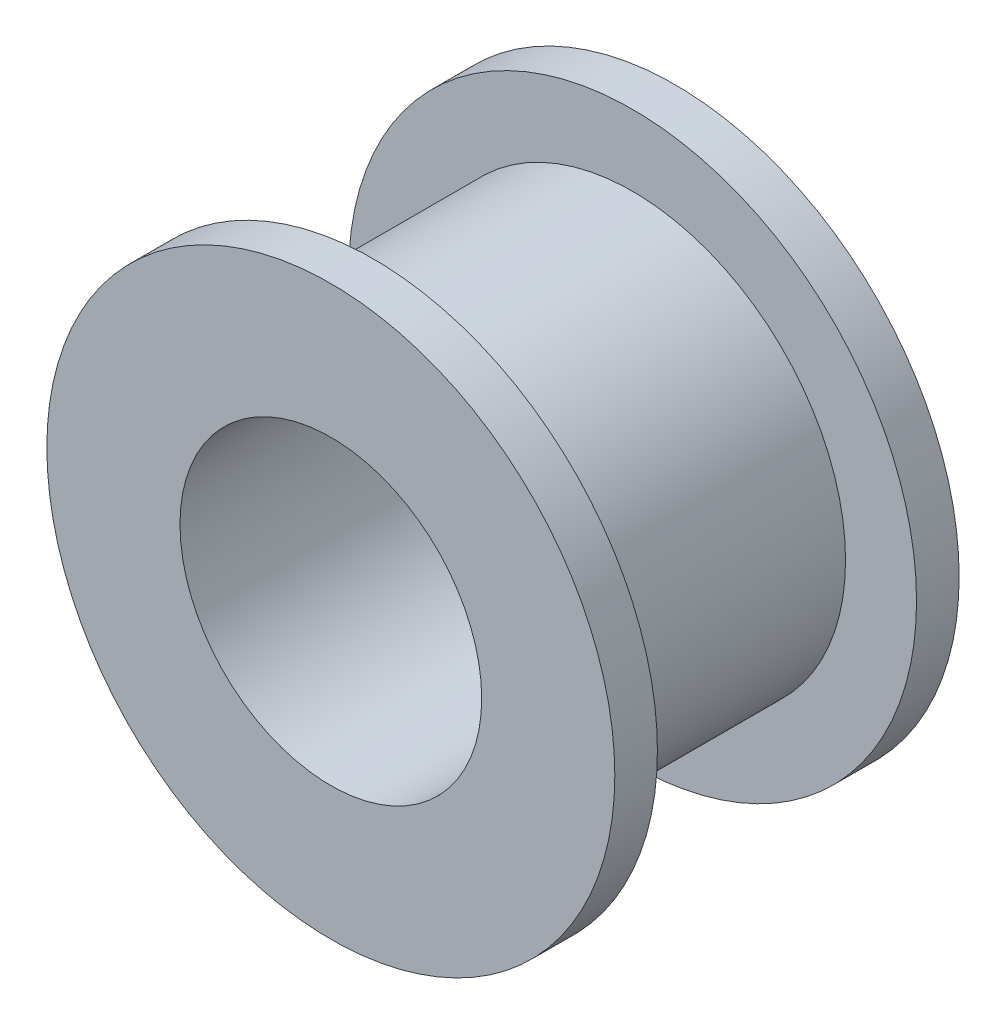
ISO-10303-21;
HEADER;
FILE_DESCRIPTION(('STEP AP214'),'2;1');
FILE_NAME('part.step','',(''),(''),'','','');
FILE_SCHEMA(('AUTOMOTIVE_DESIGN { 1 0 10303 214 1 1 1 1 }'));
ENDSEC;
DATA;
#1=APPLICATION_CONTEXT('core data for automotive mechanical design processes');
#2=APPLICATION_PROTOCOL_DEFINITION('international standard','automotive_design',2000,#1);
#3=PRODUCT_CONTEXT('',#1,'mechanical');
#4=PRODUCT('Part','Part','',(#3));
#5=PRODUCT_RELATED_PRODUCT_CATEGORY('part','',(#4));
#6=PRODUCT_DEFINITION_FORMATION('','',#4);
#7=PRODUCT_DEFINITION_CONTEXT('part definition',#1,'design');
#8=PRODUCT_DEFINITION('design','',#6,#7);
#9=PRODUCT_DEFINITION_SHAPE('','',#8);
#10=(LENGTH_UNIT() NAMED_UNIT(*) SI_UNIT(.MILLI.,.METRE.));
#11=(NAMED_UNIT(*) PLANE_ANGLE_UNIT() SI_UNIT($,.RADIAN.));
#12=(NAMED_UNIT(*) SI_UNIT($,.STERADIAN.) SOLID_ANGLE_UNIT());
#13=UNCERTAINTY_MEASURE_WITH_UNIT(LENGTH_MEASURE(1.E-05),#10,'distance_accuracy_value','');
#14=(GEOMETRIC_REPRESENTATION_CONTEXT(3) GLOBAL_UNCERTAINTY_ASSIGNED_CONTEXT((#13)) GLOBAL_UNIT_ASSIGNED_CONTEXT((#10,
#11,#12)) REPRESENTATION_CONTEXT('',''));
#15=CARTESIAN_POINT('',(0.,0.,0.));
#16=DIRECTION('',(0.,0.,1.));
#17=DIRECTION('',(1.,0.,0.));
#18=AXIS2_PLACEMENT_3D('',#15,#16,#17);
#19=CARTESIAN_POINT('',(0.,0.,16.));
#20=DIRECTION('',(0.,0.,-1.));
#21=DIRECTION('',(-1.,0.,0.));
#22=AXIS2_PLACEMENT_3D('',#19,#20,#21);
#23=CYLINDRICAL_SURFACE('',#22,8.);
#24=CARTESIAN_POINT('',(0.,0.,8.5));
#25=DIRECTION('',(0.,0.,1.));
#26=DIRECTION('',(1.,0.,0.));
#27=AXIS2_PLACEMENT_3D('',#24,#25,#26);
#28=CIRCLE('',#27,8.);
#29=CARTESIAN_POINT('',(8.,0.,8.5));
#30=VERTEX_POINT('',#29);
#31=EDGE_CURVE('E60',#30,#30,#28,.T.);
#32=ORIENTED_EDGE('',*,*,#31,.T.);
#33=EDGE_LOOP('',(#32));
#34=FACE_BOUND('',#33,.T.);
#35=CARTESIAN_POINT('',(0.,0.,9.7));
#36=DIRECTION('',(0.,0.,1.));
#37=DIRECTION('',(1.,0.,0.));
#38=AXIS2_PLACEMENT_3D('',#35,#36,#37);
#39=CIRCLE('',#38,8.);
#40=CARTESIAN_POINT('',(8.,0.,9.7));
#41=VERTEX_POINT('',#40);
#42=EDGE_CURVE('E89',#41,#41,#39,.T.);
#43=ORIENTED_EDGE('',*,*,#42,.F.);
#44=EDGE_LOOP('',(#43));
#45=FACE_BOUND('',#44,.T.);
#46=ADVANCED_FACE('F44',(#34,#45),#23,.T.);
#47=CARTESIAN_POINT('',(0.,0.,16.));
#48=DIRECTION('',(0.,0.,-1.));
#49=DIRECTION('',(-1.,0.,0.));
#50=AXIS2_PLACEMENT_3D('',#47,#48,#49);
#51=CYLINDRICAL_SURFACE('',#50,4.25);
#52=CARTESIAN_POINT('',(0.,0.,0.));
#53=DIRECTION('',(0.,0.,1.));
#54=DIRECTION('',(1.,0.,0.));
#55=AXIS2_PLACEMENT_3D('',#52,#53,#54);
#56=CIRCLE('',#55,4.25);
#57=CARTESIAN_POINT('',(4.25,0.,0.));
#58=VERTEX_POINT('',#57);
#59=EDGE_CURVE('E51',#58,#58,#56,.T.);
#60=ORIENTED_EDGE('',*,*,#59,.F.);
#61=EDGE_LOOP('',(#60));
#62=FACE_BOUND('',#61,.T.);
#63=CARTESIAN_POINT('',(0.,0.,9.7));
#64=DIRECTION('',(0.,0.,1.));
#65=DIRECTION('',(1.,0.,0.));
#66=AXIS2_PLACEMENT_3D('',#63,#64,#65);
#67=CIRCLE('',#66,4.25);
#68=CARTESIAN_POINT('',(4.25,0.,9.7));
#69=VERTEX_POINT('',#68);
#70=EDGE_CURVE('E47',#69,#69,#67,.T.);
#71=ORIENTED_EDGE('',*,*,#70,.T.);
#72=EDGE_LOOP('',(#71));
#73=FACE_BOUND('',#72,.T.);
#74=ADVANCED_FACE('F71',(#62,#73),#51,.F.);
#75=CARTESIAN_POINT('',(0.,0.,0.));
#76=DIRECTION('',(0.,0.,1.));
#77=DIRECTION('',(1.,0.,0.));
#78=AXIS2_PLACEMENT_3D('',#75,#76,#77);
#79=CIRCLE('',#78,8.);
#80=CARTESIAN_POINT('',(8.,0.,0.));
#81=VERTEX_POINT('',#80);
#82=EDGE_CURVE('E11',#81,#81,#79,.T.);
#83=ORIENTED_EDGE('',*,*,#82,.T.);
#84=EDGE_LOOP('',(#83));
#85=FACE_BOUND('',#84,.T.);
#86=CARTESIAN_POINT('',(0.,0.,1.2));
#87=DIRECTION('',(0.,0.,1.));
#88=DIRECTION('',(1.,0.,0.));
#89=AXIS2_PLACEMENT_3D('',#86,#87,#88);
#90=CIRCLE('',#89,8.);
#91=CARTESIAN_POINT('',(8.,0.,1.2));
#92=VERTEX_POINT('',#91);
#93=EDGE_CURVE('E56',#92,#92,#90,.T.);
#94=ORIENTED_EDGE('',*,*,#93,.F.);
#95=EDGE_LOOP('',(#94));
#96=FACE_BOUND('',#95,.T.);
#97=ADVANCED_FACE('F68',(#85,#96),#23,.T.);
#98=CARTESIAN_POINT('',(0.,0.,0.));
#99=DIRECTION('',(0.,0.,1.));
#100=DIRECTION('',(1.,0.,0.));
#101=AXIS2_PLACEMENT_3D('',#98,#99,#100);
#102=PLANE('',#101);
#103=CARTESIAN_POINT('',(-3.60018467029137,-4.95522909054657,0.));
#104=DIRECTION('',(0.,0.,-1.));
#105=DIRECTION('',(-1.,0.,0.));
#106=AXIS2_PLACEMENT_3D('',#103,#104,#105);
#107=CIRCLE('',#106,1.);
#108=CARTESIAN_POINT('',(-4.60018467029137,-4.95522909054657,0.));
#109=VERTEX_POINT('',#108);
#110=EDGE_CURVE('E255',#109,#109,#107,.T.);
#111=ORIENTED_EDGE('',*,*,#110,.F.);
#112=EDGE_LOOP('',(#111));
#113=FACE_BOUND('',#112,.T.);
#114=CARTESIAN_POINT('',(-5.82522116230782,1.89272909054654,0.));
#115=DIRECTION('',(0.,0.,-1.));
#116=DIRECTION('',(-1.,0.,0.));
#117=AXIS2_PLACEMENT_3D('',#114,#115,#116);
#118=CIRCLE('',#117,1.);
#119=CARTESIAN_POINT('',(-6.82522116230782,1.89272909054654,0.));
#120=VERTEX_POINT('',#119);
#121=EDGE_CURVE('E263',#120,#120,#118,.T.);
#122=ORIENTED_EDGE('',*,*,#121,.F.);
#123=EDGE_LOOP('',(#122));
#124=FACE_BOUND('',#123,.T.);
#125=CARTESIAN_POINT('',(0.,6.125,0.));
#126=DIRECTION('',(0.,0.,-1.));
#127=DIRECTION('',(-1.,0.,0.));
#128=AXIS2_PLACEMENT_3D('',#125,#126,#127);
#129=CIRCLE('',#128,1.);
#130=CARTESIAN_POINT('',(-1.,6.125,0.));
#131=VERTEX_POINT('',#130);
#132=EDGE_CURVE('E269',#131,#131,#129,.T.);
#133=ORIENTED_EDGE('',*,*,#132,.F.);
#134=EDGE_LOOP('',(#133));
#135=FACE_BOUND('',#134,.T.);
#136=CARTESIAN_POINT('',(5.82522116230779,1.89272909054662,0.));
#137=DIRECTION('',(0.,0.,-1.));
#138=DIRECTION('',(-1.,0.,0.));
#139=AXIS2_PLACEMENT_3D('',#136,#137,#138);
#140=CIRCLE('',#139,1.);
#141=CARTESIAN_POINT('',(4.82522116230779,1.89272909054662,0.));
#142=VERTEX_POINT('',#141);
#143=EDGE_CURVE('E275',#142,#142,#140,.T.);
#144=ORIENTED_EDGE('',*,*,#143,.F.);
#145=EDGE_LOOP('',(#144));
#146=FACE_BOUND('',#145,.T.);
#147=CARTESIAN_POINT('',(3.60018467029144,-4.95522909054652,0.));
#148=DIRECTION('',(0.,0.,-1.));
#149=DIRECTION('',(-1.,0.,0.));
#150=AXIS2_PLACEMENT_3D('',#147,#148,#149);
#151=CIRCLE('',#150,1.);
#152=CARTESIAN_POINT('',(2.60018467029144,-4.95522909054652,0.));
#153=VERTEX_POINT('',#152);
#154=EDGE_CURVE('E96',#153,#153,#151,.T.);
#155=ORIENTED_EDGE('',*,*,#154,.F.);
#156=EDGE_LOOP('',(#155));
#157=FACE_BOUND('',#156,.T.);
#158=ORIENTED_EDGE('',*,*,#82,.F.);
#159=EDGE_LOOP('',(#158));
#160=FACE_BOUND('',#159,.T.);
#161=ORIENTED_EDGE('',*,*,#59,.T.);
#162=EDGE_LOOP('',(#161));
#163=FACE_BOUND('',#162,.T.);
#164=ADVANCED_FACE('F70',(#113,#124,#135,#146,#157,#160,#163),#102,.F.);
#165=CARTESIAN_POINT('',(0.,0.,1.2));
#166=DIRECTION('',(0.,0.,1.));
#167=DIRECTION('',(1.,0.,0.));
#168=AXIS2_PLACEMENT_3D('',#165,#166,#167);
#169=PLANE('',#168);
#170=CARTESIAN_POINT('',(0.,0.,1.2));
#171=DIRECTION('',(0.,0.,1.));
#172=DIRECTION('',(1.,0.,0.));
#173=AXIS2_PLACEMENT_3D('',#170,#171,#172);
#174=CIRCLE('',#173,6.);
#175=CARTESIAN_POINT('',(-6.,0.,1.2));
#176=VERTEX_POINT('',#175);
#177=EDGE_CURVE('E62',#176,#176,#174,.T.);
#178=ORIENTED_EDGE('',*,*,#177,.F.);
#179=EDGE_LOOP('',(#178));
#180=FACE_BOUND('',#179,.T.);
#181=ORIENTED_EDGE('',*,*,#93,.T.);
#182=EDGE_LOOP('',(#181));
#183=FACE_BOUND('',#182,.T.);
#184=ADVANCED_FACE('F66',(#180,#183),#169,.T.);
#185=CARTESIAN_POINT('',(0.,0.,8.5));
#186=DIRECTION('',(0.,0.,1.));
#187=DIRECTION('',(1.,0.,0.));
#188=AXIS2_PLACEMENT_3D('',#185,#186,#187);
#189=PLANE('',#188);
#190=CARTESIAN_POINT('',(0.,0.,8.5));
#191=DIRECTION('',(0.,0.,1.));
#192=DIRECTION('',(1.,0.,0.));
#193=AXIS2_PLACEMENT_3D('',#190,#191,#192);
#194=CIRCLE('',#193,6.);
#195=CARTESIAN_POINT('',(-6.,0.,8.5));
#196=VERTEX_POINT('',#195);
#197=EDGE_CURVE('E94',#196,#196,#194,.T.);
#198=ORIENTED_EDGE('',*,*,#197,.T.);
#199=EDGE_LOOP('',(#198));
#200=FACE_BOUND('',#199,.T.);
#201=ORIENTED_EDGE('',*,*,#31,.F.);
#202=EDGE_LOOP('',(#201));
#203=FACE_BOUND('',#202,.T.);
#204=ADVANCED_FACE('F104',(#200,#203),#189,.F.);
#205=CARTESIAN_POINT('',(0.,0.,31.3536911679492));
#206=DIRECTION('',(0.,0.,-1.));
#207=DIRECTION('',(-1.,0.,0.));
#208=AXIS2_PLACEMENT_3D('',#205,#206,#207);
#209=CYLINDRICAL_SURFACE('',#208,6.);
#210=CARTESIAN_POINT('',(-6.,0.,1.2));
#211=CARTESIAN_POINT('',(-6.,0.,1.27604166666667));
#212=CARTESIAN_POINT('',(-6.,0.,1.35208333333334));
#213=CARTESIAN_POINT('',(-6.,0.,1.50416666666667));
#214=CARTESIAN_POINT('',(-6.,0.,1.58020833333334));
#215=CARTESIAN_POINT('',(-6.,0.,1.73229166666667));
#216=CARTESIAN_POINT('',(-6.,0.,1.80833333333334));
#217=CARTESIAN_POINT('',(-6.,0.,1.96041666666667));
#218=CARTESIAN_POINT('',(-6.,0.,2.03645833333334));
#219=CARTESIAN_POINT('',(-6.,0.,2.18854166666667));
#220=CARTESIAN_POINT('',(-6.,0.,2.26458333333334));
#221=CARTESIAN_POINT('',(-6.,0.,2.41666666666667));
#222=CARTESIAN_POINT('',(-6.,0.,2.49270833333334));
#223=CARTESIAN_POINT('',(-6.,0.,2.64479166666667));
#224=CARTESIAN_POINT('',(-6.,0.,2.72083333333333));
#225=CARTESIAN_POINT('',(-6.,0.,2.87291666666667));
#226=CARTESIAN_POINT('',(-6.,0.,2.94895833333334));
#227=CARTESIAN_POINT('',(-6.,0.,3.10104166666667));
#228=CARTESIAN_POINT('',(-6.,0.,3.17708333333334));
#229=CARTESIAN_POINT('',(-6.,0.,3.32916666666667));
#230=CARTESIAN_POINT('',(-6.,0.,3.40520833333334));
#231=CARTESIAN_POINT('',(-6.,0.,3.55729166666667));
#232=CARTESIAN_POINT('',(-6.,0.,3.63333333333333));
#233=CARTESIAN_POINT('',(-6.,0.,3.78541666666667));
#234=CARTESIAN_POINT('',(-6.,0.,3.86145833333333));
#235=CARTESIAN_POINT('',(-6.,0.,4.01354166666667));
#236=CARTESIAN_POINT('',(-6.,0.,4.08958333333333));
#237=CARTESIAN_POINT('',(-6.,0.,4.24166666666667));
#238=CARTESIAN_POINT('',(-6.,0.,4.31770833333334));
#239=CARTESIAN_POINT('',(-6.,0.,4.46979166666667));
#240=CARTESIAN_POINT('',(-6.,0.,4.54583333333334));
#241=CARTESIAN_POINT('',(-6.,0.,4.69791666666667));
#242=CARTESIAN_POINT('',(-6.,0.,4.77395833333333));
#243=CARTESIAN_POINT('',(-6.,0.,4.92604166666667));
#244=CARTESIAN_POINT('',(-6.,0.,5.00208333333333));
#245=CARTESIAN_POINT('',(-6.,0.,5.15416666666667));
#246=CARTESIAN_POINT('',(-6.,0.,5.23020833333333));
#247=CARTESIAN_POINT('',(-6.,0.,5.38229166666667));
#248=CARTESIAN_POINT('',(-6.,0.,5.45833333333333));
#249=CARTESIAN_POINT('',(-6.,0.,5.61041666666667));
#250=CARTESIAN_POINT('',(-6.,0.,5.68645833333333));
#251=CARTESIAN_POINT('',(-6.,0.,5.83854166666667));
#252=CARTESIAN_POINT('',(-6.,0.,5.91458333333333));
#253=CARTESIAN_POINT('',(-6.,0.,6.06666666666667));
#254=CARTESIAN_POINT('',(-6.,0.,6.14270833333333));
#255=CARTESIAN_POINT('',(-6.,0.,6.29479166666667));
#256=CARTESIAN_POINT('',(-6.,0.,6.37083333333333));
#257=CARTESIAN_POINT('',(-6.,0.,6.52291666666666));
#258=CARTESIAN_POINT('',(-6.,0.,6.59895833333333));
#259=CARTESIAN_POINT('',(-6.,0.,6.75104166666666));
#260=CARTESIAN_POINT('',(-6.,0.,6.82708333333333));
#261=CARTESIAN_POINT('',(-6.,0.,6.97916666666667));
#262=CARTESIAN_POINT('',(-6.,0.,7.05520833333333));
#263=CARTESIAN_POINT('',(-6.,0.,7.20729166666666));
#264=CARTESIAN_POINT('',(-6.,0.,7.28333333333333));
#265=CARTESIAN_POINT('',(-6.,0.,7.43541666666666));
#266=CARTESIAN_POINT('',(-6.,0.,7.51145833333333));
#267=CARTESIAN_POINT('',(-6.,0.,7.66354166666666));
#268=CARTESIAN_POINT('',(-6.,0.,7.73958333333333));
#269=CARTESIAN_POINT('',(-6.,0.,7.89166666666666));
#270=CARTESIAN_POINT('',(-6.,0.,7.96770833333333));
#271=CARTESIAN_POINT('',(-6.,0.,8.11979166666667));
#272=CARTESIAN_POINT('',(-6.,0.,8.19583333333333));
#273=CARTESIAN_POINT('',(-6.,0.,8.34791666666666));
#274=CARTESIAN_POINT('',(-6.,0.,8.42395833333333));
#275=CARTESIAN_POINT('',(-6.,0.,8.5));
#276=B_SPLINE_CURVE_WITH_KNOTS('',3,(#210,#211,#212,#213,#214,#215,#216,#217,#218,#219,#220,
#221,#222,#223,#224,#225,#226,#227,#228,#229,#230,#231,#232,#233,#234,#235,#236,#237,#238,#239,
#240,#241,#242,#243,#244,#245,#246,#247,#248,#249,#250,#251,#252,#253,#254,#255,#256,#257,#258,
#259,#260,#261,#262,#263,#264,#265,#266,#267,#268,#269,#270,#271,#272,#273,#274,#275),
.UNSPECIFIED.,.F.,.F.,(4,2,2,2,2,2,2,2,2,2,2,2,2,2,2,2,2,2,2,2,2,2,2,2,2,2,2,2,2,2,2,2,4),(0.,
0.228124999999999,0.456249999999998,0.684375000000001,0.9125,1.140625,1.36875,1.596875,1.825,
2.053125,2.28125,2.509375,2.7375,2.965625,3.19375,3.421875,3.65,3.878125,4.10625,
4.33437499999999,4.5625,4.790625,5.01875,5.24687499999999,5.47499999999999,5.703125,5.93125,
6.15937499999999,6.38749999999999,6.61562499999999,6.84375,7.071875,7.29999999999999),.UNSPECIFIED.);
#277=EDGE_CURVE('BSEAM107',#176,#196,#276,.T.);
#278=ORIENTED_EDGE('',*,*,#177,.T.);
#279=ORIENTED_EDGE('',*,*,#197,.F.);
#280=ORIENTED_EDGE('',*,*,#277,.T.);
#281=ORIENTED_EDGE('',*,*,#277,.F.);
#282=EDGE_LOOP('',(#278,#280,#279,#281));
#283=FACE_BOUND('',#282,.T.);
#284=ADVANCED_FACE('F107',(#283),#209,.T.);
#285=CARTESIAN_POINT('',(0.,0.,9.7));
#286=DIRECTION('',(0.,0.,1.));
#287=DIRECTION('',(1.,0.,0.));
#288=AXIS2_PLACEMENT_3D('',#285,#286,#287);
#289=PLANE('',#288);
#290=ORIENTED_EDGE('',*,*,#70,.F.);
#291=EDGE_LOOP('',(#290));
#292=FACE_BOUND('',#291,.T.);
#293=ORIENTED_EDGE('',*,*,#42,.T.);
#294=EDGE_LOOP('',(#293));
#295=FACE_BOUND('',#294,.T.);
#296=ADVANCED_FACE('F108',(#292,#295),#289,.T.);
#297=CARTESIAN_POINT('',(3.60018467029144,-4.95522909054652,1.));
#298=DIRECTION('',(0.,0.,-1.));
#299=DIRECTION('',(-1.,0.,0.));
#300=AXIS2_PLACEMENT_3D('',#297,#298,#299);
#301=CYLINDRICAL_SURFACE('',#300,1.);
#302=CARTESIAN_POINT('',(3.60018467029144,-4.95522909054652,1.));
#303=DIRECTION('',(0.,0.,-1.));
#304=DIRECTION('',(-1.,0.,0.));
#305=AXIS2_PLACEMENT_3D('',#302,#303,#304);
#306=CIRCLE('',#305,1.);
#307=CARTESIAN_POINT('',(2.60018467029144,-4.95522909054652,1.));
#308=VERTEX_POINT('',#307);
#309=EDGE_CURVE('E91',#308,#308,#306,.T.);
#310=ORIENTED_EDGE('',*,*,#309,.F.);
#311=EDGE_LOOP('',(#310));
#312=FACE_BOUND('',#311,.T.);
#313=ORIENTED_EDGE('',*,*,#154,.T.);
#314=EDGE_LOOP('',(#313));
#315=FACE_BOUND('',#314,.T.);
#316=ADVANCED_FACE('F115',(#312,#315),#301,.F.);
#317=CARTESIAN_POINT('',(3.60018467029144,-4.95522909054652,1.));
#318=DIRECTION('',(0.,0.,-1.));
#319=DIRECTION('',(-1.,0.,0.));
#320=AXIS2_PLACEMENT_3D('',#317,#318,#319);
#321=PLANE('',#320);
#322=ORIENTED_EDGE('',*,*,#309,.T.);
#323=EDGE_LOOP('',(#322));
#324=FACE_BOUND('',#323,.T.);
#325=ADVANCED_FACE('F159',(#324),#321,.T.);
#326=CARTESIAN_POINT('',(5.82522116230779,1.89272909054662,1.));
#327=DIRECTION('',(0.,0.,-1.));
#328=DIRECTION('',(-1.,0.,0.));
#329=AXIS2_PLACEMENT_3D('',#326,#327,#328);
#330=CYLINDRICAL_SURFACE('',#329,1.);
#331=CARTESIAN_POINT('',(5.82522116230779,1.89272909054662,1.));
#332=DIRECTION('',(0.,0.,-1.));
#333=DIRECTION('',(-1.,0.,0.));
#334=AXIS2_PLACEMENT_3D('',#331,#332,#333);
#335=CIRCLE('',#334,1.);
#336=CARTESIAN_POINT('',(4.82522116230779,1.89272909054662,1.));
#337=VERTEX_POINT('',#336);
#338=EDGE_CURVE('E272',#337,#337,#335,.T.);
#339=ORIENTED_EDGE('',*,*,#338,.F.);
#340=EDGE_LOOP('',(#339));
#341=FACE_BOUND('',#340,.T.);
#342=ORIENTED_EDGE('',*,*,#143,.T.);
#343=EDGE_LOOP('',(#342));
#344=FACE_BOUND('',#343,.T.);
#345=ADVANCED_FACE('F169',(#341,#344),#330,.F.);
#346=CARTESIAN_POINT('',(5.82522116230779,1.89272909054662,1.));
#347=DIRECTION('',(0.,0.,-1.));
#348=DIRECTION('',(-1.,0.,0.));
#349=AXIS2_PLACEMENT_3D('',#346,#347,#348);
#350=PLANE('',#349);
#351=ORIENTED_EDGE('',*,*,#338,.T.);
#352=EDGE_LOOP('',(#351));
#353=FACE_BOUND('',#352,.T.);
#354=ADVANCED_FACE('F179',(#353),#350,.T.);
#355=CARTESIAN_POINT('',(0.,6.125,1.));
#356=DIRECTION('',(0.,0.,-1.));
#357=DIRECTION('',(-1.,0.,0.));
#358=AXIS2_PLACEMENT_3D('',#355,#356,#357);
#359=CYLINDRICAL_SURFACE('',#358,1.);
#360=CARTESIAN_POINT('',(0.,6.125,1.));
#361=DIRECTION('',(0.,0.,-1.));
#362=DIRECTION('',(-1.,0.,0.));
#363=AXIS2_PLACEMENT_3D('',#360,#361,#362);
#364=CIRCLE('',#363,1.);
#365=CARTESIAN_POINT('',(-1.,6.125,1.));
#366=VERTEX_POINT('',#365);
#367=EDGE_CURVE('E266',#366,#366,#364,.T.);
#368=ORIENTED_EDGE('',*,*,#367,.F.);
#369=EDGE_LOOP('',(#368));
#370=FACE_BOUND('',#369,.T.);
#371=ORIENTED_EDGE('',*,*,#132,.T.);
#372=EDGE_LOOP('',(#371));
#373=FACE_BOUND('',#372,.T.);
#374=ADVANCED_FACE('F189',(#370,#373),#359,.F.);
#375=CARTESIAN_POINT('',(0.,6.125,1.));
#376=DIRECTION('',(0.,0.,-1.));
#377=DIRECTION('',(-1.,0.,0.));
#378=AXIS2_PLACEMENT_3D('',#375,#376,#377);
#379=PLANE('',#378);
#380=ORIENTED_EDGE('',*,*,#367,.T.);
#381=EDGE_LOOP('',(#380));
#382=FACE_BOUND('',#381,.T.);
#383=ADVANCED_FACE('F199',(#382),#379,.T.);
#384=CARTESIAN_POINT('',(-5.82522116230782,1.89272909054654,1.));
#385=DIRECTION('',(0.,0.,-1.));
#386=DIRECTION('',(-1.,0.,0.));
#387=AXIS2_PLACEMENT_3D('',#384,#385,#386);
#388=CYLINDRICAL_SURFACE('',#387,1.);
#389=CARTESIAN_POINT('',(-5.82522116230782,1.89272909054654,1.));
#390=DIRECTION('',(0.,0.,-1.));
#391=DIRECTION('',(-1.,0.,0.));
#392=AXIS2_PLACEMENT_3D('',#389,#390,#391);
#393=CIRCLE('',#392,1.);
#394=CARTESIAN_POINT('',(-6.82522116230782,1.89272909054654,1.));
#395=VERTEX_POINT('',#394);
#396=EDGE_CURVE('E258',#395,#395,#393,.T.);
#397=ORIENTED_EDGE('',*,*,#396,.F.);
#398=EDGE_LOOP('',(#397));
#399=FACE_BOUND('',#398,.T.);
#400=ORIENTED_EDGE('',*,*,#121,.T.);
#401=EDGE_LOOP('',(#400));
#402=FACE_BOUND('',#401,.T.);
#403=ADVANCED_FACE('F209',(#399,#402),#388,.F.);
#404=CARTESIAN_POINT('',(-5.82522116230782,1.89272909054654,1.));
#405=DIRECTION('',(0.,0.,-1.));
#406=DIRECTION('',(-1.,0.,0.));
#407=AXIS2_PLACEMENT_3D('',#404,#405,#406);
#408=PLANE('',#407);
#409=ORIENTED_EDGE('',*,*,#396,.T.);
#410=EDGE_LOOP('',(#409));
#411=FACE_BOUND('',#410,.T.);
#412=ADVANCED_FACE('F219',(#411),#408,.T.);
#413=CARTESIAN_POINT('',(-3.60018467029137,-4.95522909054657,1.));
#414=DIRECTION('',(0.,0.,-1.));
#415=DIRECTION('',(-1.,0.,0.));
#416=AXIS2_PLACEMENT_3D('',#413,#414,#415);
#417=CYLINDRICAL_SURFACE('',#416,1.);
#418=CARTESIAN_POINT('',(-3.60018467029137,-4.95522909054657,1.));
#419=DIRECTION('',(0.,0.,-1.));
#420=DIRECTION('',(-1.,0.,0.));
#421=AXIS2_PLACEMENT_3D('',#418,#419,#420);
#422=CIRCLE('',#421,1.);
#423=CARTESIAN_POINT('',(-4.60018467029137,-4.95522909054657,1.));
#424=VERTEX_POINT('',#423);
#425=EDGE_CURVE('E254',#424,#424,#422,.T.);
#426=ORIENTED_EDGE('',*,*,#425,.F.);
#427=EDGE_LOOP('',(#426));
#428=FACE_BOUND('',#427,.T.);
#429=ORIENTED_EDGE('',*,*,#110,.T.);
#430=EDGE_LOOP('',(#429));
#431=FACE_BOUND('',#430,.T.);
#432=ADVANCED_FACE('F229',(#428,#431),#417,.F.);
#433=CARTESIAN_POINT('',(-3.60018467029137,-4.95522909054657,1.));
#434=DIRECTION('',(0.,0.,-1.));
#435=DIRECTION('',(-1.,0.,0.));
#436=AXIS2_PLACEMENT_3D('',#433,#434,#435);
#437=PLANE('',#436);
#438=ORIENTED_EDGE('',*,*,#425,.T.);
#439=EDGE_LOOP('',(#438));
#440=FACE_BOUND('',#439,.T.);
#441=ADVANCED_FACE('F239',(#440),#437,.T.);
#442=CLOSED_SHELL('',(#46,#74,#97,#164,#184,#204,#284,#296,#316,#325,#345,#354,#374,#383,#403,
#412,#432,#441));
#443=MANIFOLD_SOLID_BREP('B2',#442);
#444=ADVANCED_BREP_SHAPE_REPRESENTATION('',(#18,#443),#14);
#445=SHAPE_DEFINITION_REPRESENTATION(#9,#444);
ENDSEC;
END-ISO-10303-21;
